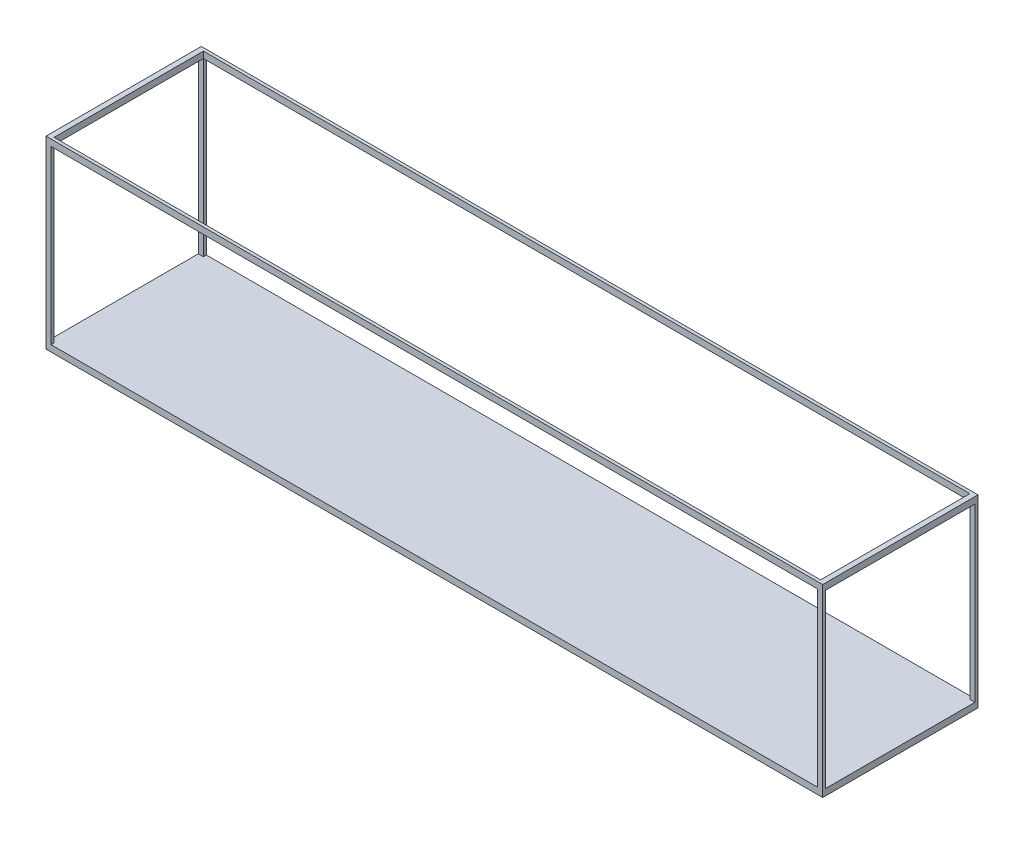
ISO-10303-21;
HEADER;
FILE_DESCRIPTION(('STEP AP214'),'2;1');
FILE_NAME('part.step','',(''),(''),'','','');
FILE_SCHEMA(('AUTOMOTIVE_DESIGN { 1 0 10303 214 1 1 1 1 }'));
ENDSEC;
DATA;
#1=APPLICATION_CONTEXT('core data for automotive mechanical design processes');
#2=APPLICATION_PROTOCOL_DEFINITION('international standard','automotive_design',2000,#1);
#3=PRODUCT_CONTEXT('',#1,'mechanical');
#4=PRODUCT('Part','Part','',(#3));
#5=PRODUCT_RELATED_PRODUCT_CATEGORY('part','',(#4));
#6=PRODUCT_DEFINITION_FORMATION('','',#4);
#7=PRODUCT_DEFINITION_CONTEXT('part definition',#1,'design');
#8=PRODUCT_DEFINITION('design','',#6,#7);
#9=PRODUCT_DEFINITION_SHAPE('','',#8);
#10=(LENGTH_UNIT() NAMED_UNIT(*) SI_UNIT(.MILLI.,.METRE.));
#11=(NAMED_UNIT(*) PLANE_ANGLE_UNIT() SI_UNIT($,.RADIAN.));
#12=(NAMED_UNIT(*) SI_UNIT($,.STERADIAN.) SOLID_ANGLE_UNIT());
#13=UNCERTAINTY_MEASURE_WITH_UNIT(LENGTH_MEASURE(1.E-05),#10,'distance_accuracy_value','');
#14=(GEOMETRIC_REPRESENTATION_CONTEXT(3) GLOBAL_UNCERTAINTY_ASSIGNED_CONTEXT((#13)) GLOBAL_UNIT_ASSIGNED_CONTEXT((#10,
#11,#12)) REPRESENTATION_CONTEXT('',''));
#15=CARTESIAN_POINT('',(0.,0.,0.));
#16=DIRECTION('',(0.,0.,1.));
#17=DIRECTION('',(1.,0.,0.));
#18=AXIS2_PLACEMENT_3D('',#15,#16,#17);
#19=CARTESIAN_POINT('',(-5.31344307270271,2696.81328806584,2438.));
#20=DIRECTION('',(1.,0.,0.));
#21=DIRECTION('',(0.,1.,0.));
#22=AXIS2_PLACEMENT_3D('',#19,#20,#21);
#23=PLANE('',#22);
#24=DIRECTION('',(0.,-1.,0.));
#25=VECTOR('',#24,1.);
#26=CARTESIAN_POINT('',(-5.31344307270271,2696.81328806584,2391.));
#27=LINE('',#26,#25);
#28=CARTESIAN_POINT('',(-5.31344307270309,2696.81328806584,2391.));
#29=VERTEX_POINT('',#28);
#30=CARTESIAN_POINT('',(-5.31344307270238,1.81328806584391,2391.));
#31=VERTEX_POINT('',#30);
#32=EDGE_CURVE('E166',#29,#31,#27,.T.);
#33=ORIENTED_EDGE('',*,*,#32,.F.);
#34=DIRECTION('',(0.,0.,-1.));
#35=VECTOR('',#34,1.);
#36=CARTESIAN_POINT('',(-5.31344307270271,2696.81328806584,2438.));
#37=LINE('',#36,#35);
#38=CARTESIAN_POINT('',(-5.31344307270271,2696.81328806584,2438.));
#39=VERTEX_POINT('',#38);
#40=EDGE_CURVE('E264',#39,#29,#37,.T.);
#41=ORIENTED_EDGE('',*,*,#40,.F.);
#42=DIRECTION('',(0.,-1.,0.));
#43=VECTOR('',#42,1.);
#44=CARTESIAN_POINT('',(-5.31344307270271,2696.81328806584,2438.));
#45=LINE('',#44,#43);
#46=CARTESIAN_POINT('',(-5.31344307270238,1.81328806584391,2438.));
#47=VERTEX_POINT('',#46);
#48=EDGE_CURVE('E243',#39,#47,#45,.T.);
#49=ORIENTED_EDGE('',*,*,#48,.T.);
#50=DIRECTION('',(0.,0.,-1.));
#51=VECTOR('',#50,1.);
#52=CARTESIAN_POINT('',(-5.31344307270238,1.81328806584391,2438.));
#53=LINE('',#52,#51);
#54=EDGE_CURVE('E276',#47,#31,#53,.T.);
#55=ORIENTED_EDGE('',*,*,#54,.T.);
#56=EDGE_LOOP('',(#33,#41,#49,#55));
#57=FACE_BOUND('',#56,.T.);
#58=ADVANCED_FACE('F34',(#57),#23,.T.);
#59=DIRECTION('',(0.,0.,1.));
#60=VECTOR('',#59,1.);
#61=CARTESIAN_POINT('',(-5.31344307270271,2696.81328806584,2438.));
#62=LINE('',#61,#60);
#63=CARTESIAN_POINT('',(-5.31344307270309,2696.81328806584,47.0000000000002));
#64=VERTEX_POINT('',#63);
#65=EDGE_CURVE('E208',#64,#29,#62,.T.);
#66=ORIENTED_EDGE('',*,*,#65,.F.);
#67=DIRECTION('',(0.,1.,0.));
#68=VECTOR('',#67,1.);
#69=CARTESIAN_POINT('',(-5.31344307270349,2696.81328806584,47.));
#70=LINE('',#69,#68);
#71=CARTESIAN_POINT('',(-5.3134430727035,2797.31328806584,47.));
#72=VERTEX_POINT('',#71);
#73=EDGE_CURVE('E239',#64,#72,#70,.T.);
#74=ORIENTED_EDGE('',*,*,#73,.T.);
#75=DIRECTION('',(0.,0.,1.));
#76=VECTOR('',#75,1.);
#77=CARTESIAN_POINT('',(-5.31344307270317,2797.31328806584,2391.));
#78=LINE('',#77,#76);
#79=CARTESIAN_POINT('',(-5.31344307270317,2797.31328806584,2391.));
#80=VERTEX_POINT('',#79);
#81=EDGE_CURVE('E229',#72,#80,#78,.T.);
#82=ORIENTED_EDGE('',*,*,#81,.T.);
#83=DIRECTION('',(0.,1.,0.));
#84=VECTOR('',#83,1.);
#85=CARTESIAN_POINT('',(-5.31344307270316,2696.81328806584,2391.));
#86=LINE('',#85,#84);
#87=EDGE_CURVE('E237',#29,#80,#86,.T.);
#88=ORIENTED_EDGE('',*,*,#87,.F.);
#89=EDGE_LOOP('',(#66,#74,#82,#88));
#90=FACE_BOUND('',#89,.T.);
#91=ADVANCED_FACE('F369',(#90),#23,.T.);
#92=CARTESIAN_POINT('',(12026.6865569273,2696.81328806584,2438.));
#93=DIRECTION('',(-1.,0.,0.));
#94=DIRECTION('',(0.,0.,1.));
#95=AXIS2_PLACEMENT_3D('',#92,#93,#94);
#96=PLANE('',#95);
#97=DIRECTION('',(0.,1.,0.));
#98=VECTOR('',#97,1.);
#99=CARTESIAN_POINT('',(12026.6865569273,2696.81328806584,2391.));
#100=LINE('',#99,#98);
#101=CARTESIAN_POINT('',(12026.6865569273,1.81328806584347,2391.));
#102=VERTEX_POINT('',#101);
#103=CARTESIAN_POINT('',(12026.6865569273,2696.81328806584,2391.));
#104=VERTEX_POINT('',#103);
#105=EDGE_CURVE('E11',#102,#104,#100,.T.);
#106=ORIENTED_EDGE('',*,*,#105,.F.);
#107=DIRECTION('',(0.,0.,-1.));
#108=VECTOR('',#107,1.);
#109=CARTESIAN_POINT('',(12026.6865569273,1.81328806584391,2438.));
#110=LINE('',#109,#108);
#111=CARTESIAN_POINT('',(12026.6865569273,1.81328806584391,2438.));
#112=VERTEX_POINT('',#111);
#113=EDGE_CURVE('E272',#112,#102,#110,.T.);
#114=ORIENTED_EDGE('',*,*,#113,.F.);
#115=DIRECTION('',(0.,1.,0.));
#116=VECTOR('',#115,1.);
#117=CARTESIAN_POINT('',(12026.6865569273,2696.81328806584,2438.));
#118=LINE('',#117,#116);
#119=CARTESIAN_POINT('',(12026.6865569273,2696.81328806584,2438.));
#120=VERTEX_POINT('',#119);
#121=EDGE_CURVE('E248',#112,#120,#118,.T.);
#122=ORIENTED_EDGE('',*,*,#121,.T.);
#123=DIRECTION('',(0.,0.,-1.));
#124=VECTOR('',#123,1.);
#125=CARTESIAN_POINT('',(12026.6865569273,2696.81328806584,2438.));
#126=LINE('',#125,#124);
#127=EDGE_CURVE('E268',#120,#104,#126,.T.);
#128=ORIENTED_EDGE('',*,*,#127,.T.);
#129=EDGE_LOOP('',(#106,#114,#122,#128));
#130=FACE_BOUND('',#129,.T.);
#131=ADVANCED_FACE('F338',(#130),#96,.T.);
#132=DIRECTION('',(0.,0.,-1.));
#133=VECTOR('',#132,1.);
#134=CARTESIAN_POINT('',(12026.6865569273,2696.81328806584,2438.));
#135=LINE('',#134,#133);
#136=CARTESIAN_POINT('',(12026.6865569273,2696.81328806584,47.0000000000002));
#137=VERTEX_POINT('',#136);
#138=EDGE_CURVE('E200',#104,#137,#135,.T.);
#139=ORIENTED_EDGE('',*,*,#138,.F.);
#140=DIRECTION('',(0.,1.,0.));
#141=VECTOR('',#140,1.);
#142=CARTESIAN_POINT('',(12026.6865569273,2696.81328806584,2391.));
#143=LINE('',#142,#141);
#144=CARTESIAN_POINT('',(12026.6865569273,2797.31328806584,2391.));
#145=VERTEX_POINT('',#144);
#146=EDGE_CURVE('E234',#104,#145,#143,.T.);
#147=ORIENTED_EDGE('',*,*,#146,.T.);
#148=DIRECTION('',(0.,0.,-1.));
#149=VECTOR('',#148,1.);
#150=CARTESIAN_POINT('',(12026.6865569273,2797.31328806584,2391.));
#151=LINE('',#150,#149);
#152=CARTESIAN_POINT('',(12026.6865569273,2797.31328806584,46.9999999999984));
#153=VERTEX_POINT('',#152);
#154=EDGE_CURVE('E216',#145,#153,#151,.T.);
#155=ORIENTED_EDGE('',*,*,#154,.T.);
#156=DIRECTION('',(0.,1.,0.));
#157=VECTOR('',#156,1.);
#158=CARTESIAN_POINT('',(12026.6865569273,2696.81328806584,46.9999999999985));
#159=LINE('',#158,#157);
#160=EDGE_CURVE('E224',#137,#153,#159,.T.);
#161=ORIENTED_EDGE('',*,*,#160,.F.);
#162=EDGE_LOOP('',(#139,#147,#155,#161));
#163=FACE_BOUND('',#162,.T.);
#164=ADVANCED_FACE('F349',(#163),#96,.T.);
#165=CARTESIAN_POINT('',(-5.31344307270271,2696.81328806584,2438.));
#166=DIRECTION('',(0.,-1.,0.));
#167=DIRECTION('',(1.,0.,0.));
#168=AXIS2_PLACEMENT_3D('',#165,#166,#167);
#169=PLANE('',#168);
#170=DIRECTION('',(1.,0.,0.));
#171=VECTOR('',#170,1.);
#172=CARTESIAN_POINT('',(12026.6865569273,2696.81328806584,2391.));
#173=LINE('',#172,#171);
#174=EDGE_CURVE('E220',#29,#104,#173,.T.);
#175=ORIENTED_EDGE('',*,*,#174,.T.);
#176=ORIENTED_EDGE('',*,*,#127,.F.);
#177=DIRECTION('',(-1.,0.,0.));
#178=VECTOR('',#177,1.);
#179=CARTESIAN_POINT('',(-5.31344307270271,2696.81328806584,2438.));
#180=LINE('',#179,#178);
#181=EDGE_CURVE('E251',#120,#39,#180,.T.);
#182=ORIENTED_EDGE('',*,*,#181,.T.);
#183=ORIENTED_EDGE('',*,*,#40,.T.);
#184=EDGE_LOOP('',(#175,#176,#182,#183));
#185=FACE_BOUND('',#184,.T.);
#186=ADVANCED_FACE('F327',(#185),#169,.T.);
#187=CARTESIAN_POINT('',(0.,0.,2438.));
#188=DIRECTION('',(0.,0.,-1.));
#189=DIRECTION('',(-1.,0.,0.));
#190=AXIS2_PLACEMENT_3D('',#187,#188,#189);
#191=PLANE('',#190);
#192=DIRECTION('',(0.,1.,0.));
#193=VECTOR('',#192,1.);
#194=CARTESIAN_POINT('',(12106.6865569273,2797.31328806584,2438.));
#195=LINE('',#194,#193);
#196=CARTESIAN_POINT('',(12106.6865569273,-98.6867119341566,2438.));
#197=VERTEX_POINT('',#196);
#198=CARTESIAN_POINT('',(12106.6865569273,2797.31328806584,2438.));
#199=VERTEX_POINT('',#198);
#200=EDGE_CURVE('E279',#197,#199,#195,.T.);
#201=ORIENTED_EDGE('',*,*,#200,.T.);
#202=DIRECTION('',(-1.,0.,0.));
#203=VECTOR('',#202,1.);
#204=CARTESIAN_POINT('',(12106.6865569273,2797.31328806584,2438.));
#205=LINE('',#204,#203);
#206=CARTESIAN_POINT('',(-85.3134430727032,2797.31328806584,2438.));
#207=VERTEX_POINT('',#206);
#208=EDGE_CURVE('E282',#199,#207,#205,.T.);
#209=ORIENTED_EDGE('',*,*,#208,.T.);
#210=DIRECTION('',(0.,-1.,0.));
#211=VECTOR('',#210,1.);
#212=CARTESIAN_POINT('',(-85.3134430727032,2797.31328806584,2438.));
#213=LINE('',#212,#211);
#214=CARTESIAN_POINT('',(-85.3134430727028,-98.6867119341581,2438.));
#215=VERTEX_POINT('',#214);
#216=EDGE_CURVE('E285',#207,#215,#213,.T.);
#217=ORIENTED_EDGE('',*,*,#216,.T.);
#218=DIRECTION('',(1.,0.,0.));
#219=VECTOR('',#218,1.);
#220=CARTESIAN_POINT('',(12106.6865569273,-98.6867119341566,2438.));
#221=LINE('',#220,#219);
#222=EDGE_CURVE('E287',#215,#197,#221,.T.);
#223=ORIENTED_EDGE('',*,*,#222,.T.);
#224=EDGE_LOOP('',(#201,#209,#217,#223));
#225=FACE_BOUND('',#224,.T.);
#226=ORIENTED_EDGE('',*,*,#48,.F.);
#227=ORIENTED_EDGE('',*,*,#181,.F.);
#228=ORIENTED_EDGE('',*,*,#121,.F.);
#229=DIRECTION('',(1.,0.,0.));
#230=VECTOR('',#229,1.);
#231=CARTESIAN_POINT('',(-5.31344307270238,1.81328806584391,2438.));
#232=LINE('',#231,#230);
#233=EDGE_CURVE('E245',#47,#112,#232,.T.);
#234=ORIENTED_EDGE('',*,*,#233,.F.);
#235=EDGE_LOOP('',(#226,#227,#228,#234));
#236=FACE_BOUND('',#235,.T.);
#237=ADVANCED_FACE('F324',(#225,#236),#191,.F.);
#238=CARTESIAN_POINT('',(0.,0.,0.));
#239=DIRECTION('',(0.,0.,-1.));
#240=DIRECTION('',(-1.,0.,0.));
#241=AXIS2_PLACEMENT_3D('',#238,#239,#240);
#242=PLANE('',#241);
#243=DIRECTION('',(0.,1.,0.));
#244=VECTOR('',#243,1.);
#245=CARTESIAN_POINT('',(12106.6865569273,2797.31328806584,0.));
#246=LINE('',#245,#244);
#247=CARTESIAN_POINT('',(12106.6865569273,-98.6867119341566,0.));
#248=VERTEX_POINT('',#247);
#249=CARTESIAN_POINT('',(12106.6865569273,2797.31328806584,0.));
#250=VERTEX_POINT('',#249);
#251=EDGE_CURVE('E278',#248,#250,#246,.T.);
#252=ORIENTED_EDGE('',*,*,#251,.F.);
#253=DIRECTION('',(1.,0.,0.));
#254=VECTOR('',#253,1.);
#255=CARTESIAN_POINT('',(12106.6865569273,-98.6867119341566,0.));
#256=LINE('',#255,#254);
#257=CARTESIAN_POINT('',(-85.3134430727028,-98.6867119341581,0.));
#258=VERTEX_POINT('',#257);
#259=EDGE_CURVE('E283',#258,#248,#256,.T.);
#260=ORIENTED_EDGE('',*,*,#259,.F.);
#261=DIRECTION('',(0.,-1.,0.));
#262=VECTOR('',#261,1.);
#263=CARTESIAN_POINT('',(-85.3134430727032,2797.31328806584,0.));
#264=LINE('',#263,#262);
#265=CARTESIAN_POINT('',(-85.3134430727032,2797.31328806584,0.));
#266=VERTEX_POINT('',#265);
#267=EDGE_CURVE('E294',#266,#258,#264,.T.);
#268=ORIENTED_EDGE('',*,*,#267,.F.);
#269=DIRECTION('',(-1.,0.,0.));
#270=VECTOR('',#269,1.);
#271=CARTESIAN_POINT('',(12106.6865569273,2797.31328806584,0.));
#272=LINE('',#271,#270);
#273=EDGE_CURVE('E292',#250,#266,#272,.T.);
#274=ORIENTED_EDGE('',*,*,#273,.F.);
#275=EDGE_LOOP('',(#252,#260,#268,#274));
#276=FACE_BOUND('',#275,.T.);
#277=DIRECTION('',(-1.,0.,0.));
#278=VECTOR('',#277,1.);
#279=CARTESIAN_POINT('',(-5.31344307270271,2696.81328806584,0.));
#280=LINE('',#279,#278);
#281=CARTESIAN_POINT('',(12026.6865569273,2696.81328806584,0.));
#282=VERTEX_POINT('',#281);
#283=CARTESIAN_POINT('',(-5.31344307270271,2696.81328806584,0.));
#284=VERTEX_POINT('',#283);
#285=EDGE_CURVE('E246',#282,#284,#280,.T.);
#286=ORIENTED_EDGE('',*,*,#285,.T.);
#287=DIRECTION('',(0.,-1.,0.));
#288=VECTOR('',#287,1.);
#289=CARTESIAN_POINT('',(-5.31344307270271,2696.81328806584,0.));
#290=LINE('',#289,#288);
#291=CARTESIAN_POINT('',(-5.31344307270238,1.81328806584391,0.));
#292=VERTEX_POINT('',#291);
#293=EDGE_CURVE('E236',#284,#292,#290,.T.);
#294=ORIENTED_EDGE('',*,*,#293,.T.);
#295=DIRECTION('',(1.,0.,0.));
#296=VECTOR('',#295,1.);
#297=CARTESIAN_POINT('',(-5.31344307270238,1.81328806584391,0.));
#298=LINE('',#297,#296);
#299=CARTESIAN_POINT('',(12026.6865569273,1.81328806584391,0.));
#300=VERTEX_POINT('',#299);
#301=EDGE_CURVE('E256',#292,#300,#298,.T.);
#302=ORIENTED_EDGE('',*,*,#301,.T.);
#303=DIRECTION('',(0.,1.,0.));
#304=VECTOR('',#303,1.);
#305=CARTESIAN_POINT('',(12026.6865569273,2696.81328806584,0.));
#306=LINE('',#305,#304);
#307=EDGE_CURVE('E259',#300,#282,#306,.T.);
#308=ORIENTED_EDGE('',*,*,#307,.T.);
#309=EDGE_LOOP('',(#286,#294,#302,#308));
#310=FACE_BOUND('',#309,.T.);
#311=ADVANCED_FACE('F315',(#276,#310),#242,.T.);
#312=CARTESIAN_POINT('',(12106.6865569273,2797.31328806584,2438.));
#313=DIRECTION('',(-1.,0.,0.));
#314=DIRECTION('',(0.,0.,1.));
#315=AXIS2_PLACEMENT_3D('',#312,#313,#314);
#316=PLANE('',#315);
#317=DIRECTION('',(0.,0.,-1.));
#318=VECTOR('',#317,1.);
#319=CARTESIAN_POINT('',(12106.6865569273,1.81328806584347,2391.));
#320=LINE('',#319,#318);
#321=CARTESIAN_POINT('',(12106.6865569273,1.81328806584347,2391.));
#322=VERTEX_POINT('',#321);
#323=CARTESIAN_POINT('',(12106.6865569273,1.81328806584348,46.9999999999998));
#324=VERTEX_POINT('',#323);
#325=EDGE_CURVE('E193',#322,#324,#320,.T.);
#326=ORIENTED_EDGE('',*,*,#325,.F.);
#327=DIRECTION('',(0.,-1.,0.));
#328=VECTOR('',#327,1.);
#329=CARTESIAN_POINT('',(12106.6865569273,2696.81328806584,2391.));
#330=LINE('',#329,#328);
#331=CARTESIAN_POINT('',(12106.6865569273,2696.81328806584,2391.));
#332=VERTEX_POINT('',#331);
#333=EDGE_CURVE('E49',#332,#322,#330,.T.);
#334=ORIENTED_EDGE('',*,*,#333,.F.);
#335=DIRECTION('',(0.,0.,1.));
#336=VECTOR('',#335,1.);
#337=CARTESIAN_POINT('',(12106.6865569273,2696.81328806584,2391.));
#338=LINE('',#337,#336);
#339=CARTESIAN_POINT('',(12106.6865569273,2696.81328806584,47.0000000000002));
#340=VERTEX_POINT('',#339);
#341=EDGE_CURVE('E184',#340,#332,#338,.T.);
#342=ORIENTED_EDGE('',*,*,#341,.F.);
#343=DIRECTION('',(0.,1.,0.));
#344=VECTOR('',#343,1.);
#345=CARTESIAN_POINT('',(12106.6865569273,2696.81328806584,47.0000000000002));
#346=LINE('',#345,#344);
#347=EDGE_CURVE('E187',#324,#340,#346,.T.);
#348=ORIENTED_EDGE('',*,*,#347,.F.);
#349=EDGE_LOOP('',(#326,#334,#342,#348));
#350=FACE_BOUND('',#349,.T.);
#351=ORIENTED_EDGE('',*,*,#251,.T.);
#352=DIRECTION('',(0.,0.,-1.));
#353=VECTOR('',#352,1.);
#354=CARTESIAN_POINT('',(12106.6865569273,2797.31328806584,2438.));
#355=LINE('',#354,#353);
#356=EDGE_CURVE('E42',#199,#250,#355,.T.);
#357=ORIENTED_EDGE('',*,*,#356,.F.);
#358=ORIENTED_EDGE('',*,*,#200,.F.);
#359=DIRECTION('',(0.,0.,-1.));
#360=VECTOR('',#359,1.);
#361=CARTESIAN_POINT('',(12106.6865569273,-98.6867119341566,2438.));
#362=LINE('',#361,#360);
#363=EDGE_CURVE('E289',#197,#248,#362,.T.);
#364=ORIENTED_EDGE('',*,*,#363,.T.);
#365=EDGE_LOOP('',(#351,#357,#358,#364));
#366=FACE_BOUND('',#365,.T.);
#367=ADVANCED_FACE('F36',(#350,#366),#316,.F.);
#368=CARTESIAN_POINT('',(12106.6865569273,2797.31328806584,2438.));
#369=DIRECTION('',(0.,-1.,0.));
#370=DIRECTION('',(1.,0.,0.));
#371=AXIS2_PLACEMENT_3D('',#368,#369,#370);
#372=PLANE('',#371);
#373=DIRECTION('',(-1.,0.,0.));
#374=VECTOR('',#373,1.);
#375=CARTESIAN_POINT('',(12026.6865569273,2797.31328806584,46.9999999999985));
#376=LINE('',#375,#374);
#377=EDGE_CURVE('E226',#153,#72,#376,.T.);
#378=ORIENTED_EDGE('',*,*,#377,.F.);
#379=ORIENTED_EDGE('',*,*,#154,.F.);
#380=DIRECTION('',(1.,0.,0.));
#381=VECTOR('',#380,1.);
#382=CARTESIAN_POINT('',(12026.6865569273,2797.31328806584,2391.));
#383=LINE('',#382,#381);
#384=EDGE_CURVE('E221',#80,#145,#383,.T.);
#385=ORIENTED_EDGE('',*,*,#384,.F.);
#386=ORIENTED_EDGE('',*,*,#81,.F.);
#387=EDGE_LOOP('',(#378,#379,#385,#386));
#388=FACE_BOUND('',#387,.T.);
#389=ORIENTED_EDGE('',*,*,#273,.T.);
#390=DIRECTION('',(0.,0.,-1.));
#391=VECTOR('',#390,1.);
#392=CARTESIAN_POINT('',(-85.3134430727032,2797.31328806584,2438.));
#393=LINE('',#392,#391);
#394=EDGE_CURVE('E302',#207,#266,#393,.T.);
#395=ORIENTED_EDGE('',*,*,#394,.F.);
#396=ORIENTED_EDGE('',*,*,#208,.F.);
#397=ORIENTED_EDGE('',*,*,#356,.T.);
#398=EDGE_LOOP('',(#389,#395,#396,#397));
#399=FACE_BOUND('',#398,.T.);
#400=ADVANCED_FACE('F307',(#388,#399),#372,.F.);
#401=CARTESIAN_POINT('',(-85.3134430727032,2797.31328806584,2438.));
#402=DIRECTION('',(1.,0.,0.));
#403=DIRECTION('',(0.,1.,0.));
#404=AXIS2_PLACEMENT_3D('',#401,#402,#403);
#405=PLANE('',#404);
#406=DIRECTION('',(0.,0.,1.));
#407=VECTOR('',#406,1.);
#408=CARTESIAN_POINT('',(-85.3134430727032,2696.81328806584,2391.));
#409=LINE('',#408,#407);
#410=CARTESIAN_POINT('',(-85.3134430727032,2696.81328806584,47.0000000000002));
#411=VERTEX_POINT('',#410);
#412=CARTESIAN_POINT('',(-85.3134430727032,2696.81328806584,2391.));
#413=VERTEX_POINT('',#412);
#414=EDGE_CURVE('E183',#411,#413,#409,.T.);
#415=ORIENTED_EDGE('',*,*,#414,.T.);
#416=DIRECTION('',(0.,-1.,0.));
#417=VECTOR('',#416,1.);
#418=CARTESIAN_POINT('',(-85.3134430727032,2696.81328806584,2391.));
#419=LINE('',#418,#417);
#420=CARTESIAN_POINT('',(-85.3134430727032,1.81328806584347,2391.));
#421=VERTEX_POINT('',#420);
#422=EDGE_CURVE('E163',#413,#421,#419,.T.);
#423=ORIENTED_EDGE('',*,*,#422,.T.);
#424=DIRECTION('',(0.,0.,-1.));
#425=VECTOR('',#424,1.);
#426=CARTESIAN_POINT('',(-85.3134430727032,1.81328806584347,2391.));
#427=LINE('',#426,#425);
#428=CARTESIAN_POINT('',(-85.3134430727028,1.81328806584348,47.0000000000002));
#429=VERTEX_POINT('',#428);
#430=EDGE_CURVE('E174',#421,#429,#427,.T.);
#431=ORIENTED_EDGE('',*,*,#430,.T.);
#432=DIRECTION('',(0.,1.,0.));
#433=VECTOR('',#432,1.);
#434=CARTESIAN_POINT('',(-85.3134430727032,2696.81328806584,47.0000000000002));
#435=LINE('',#434,#433);
#436=EDGE_CURVE('E57',#429,#411,#435,.T.);
#437=ORIENTED_EDGE('',*,*,#436,.T.);
#438=EDGE_LOOP('',(#415,#423,#431,#437));
#439=FACE_BOUND('',#438,.T.);
#440=ORIENTED_EDGE('',*,*,#267,.T.);
#441=DIRECTION('',(0.,0.,-1.));
#442=VECTOR('',#441,1.);
#443=CARTESIAN_POINT('',(-85.3134430727028,-98.6867119341581,2438.));
#444=LINE('',#443,#442);
#445=EDGE_CURVE('E299',#215,#258,#444,.T.);
#446=ORIENTED_EDGE('',*,*,#445,.F.);
#447=ORIENTED_EDGE('',*,*,#216,.F.);
#448=ORIENTED_EDGE('',*,*,#394,.T.);
#449=EDGE_LOOP('',(#440,#446,#447,#448));
#450=FACE_BOUND('',#449,.T.);
#451=ADVANCED_FACE('F180',(#439,#450),#405,.F.);
#452=CARTESIAN_POINT('',(12106.6865569273,-98.6867119341566,2438.));
#453=DIRECTION('',(0.,1.,0.));
#454=DIRECTION('',(-1.,0.,0.));
#455=AXIS2_PLACEMENT_3D('',#452,#453,#454);
#456=PLANE('',#455);
#457=ORIENTED_EDGE('',*,*,#259,.T.);
#458=ORIENTED_EDGE('',*,*,#363,.F.);
#459=ORIENTED_EDGE('',*,*,#222,.F.);
#460=ORIENTED_EDGE('',*,*,#445,.T.);
#461=EDGE_LOOP('',(#457,#458,#459,#460));
#462=FACE_BOUND('',#461,.T.);
#463=ADVANCED_FACE('F322',(#462),#456,.F.);
#464=DIRECTION('',(0.,1.,0.));
#465=VECTOR('',#464,1.);
#466=CARTESIAN_POINT('',(-5.31344307270271,2696.81328806584,47.0000000000002));
#467=LINE('',#466,#465);
#468=CARTESIAN_POINT('',(-5.31344307270239,1.81328806584348,46.9999999999998));
#469=VERTEX_POINT('',#468);
#470=EDGE_CURVE('E213',#469,#64,#467,.T.);
#471=ORIENTED_EDGE('',*,*,#470,.F.);
#472=EDGE_CURVE('E275',#469,#292,#53,.T.);
#473=ORIENTED_EDGE('',*,*,#472,.T.);
#474=ORIENTED_EDGE('',*,*,#293,.F.);
#475=EDGE_CURVE('E253',#64,#284,#37,.T.);
#476=ORIENTED_EDGE('',*,*,#475,.F.);
#477=EDGE_LOOP('',(#471,#473,#474,#476));
#478=FACE_BOUND('',#477,.T.);
#479=ADVANCED_FACE('F371',(#478),#23,.T.);
#480=CARTESIAN_POINT('',(-5.31344307270238,1.81328806584391,2438.));
#481=DIRECTION('',(0.,1.,0.));
#482=DIRECTION('',(0.,0.,1.));
#483=AXIS2_PLACEMENT_3D('',#480,#481,#482);
#484=PLANE('',#483);
#485=ORIENTED_EDGE('',*,*,#472,.F.);
#486=DIRECTION('',(1.,0.,0.));
#487=VECTOR('',#486,1.);
#488=CARTESIAN_POINT('',(-85.3134430727032,1.81328806584348,46.9999999999998));
#489=LINE('',#488,#487);
#490=EDGE_CURVE('E177',#429,#469,#489,.T.);
#491=ORIENTED_EDGE('',*,*,#490,.F.);
#492=ORIENTED_EDGE('',*,*,#430,.F.);
#493=DIRECTION('',(1.,0.,0.));
#494=VECTOR('',#493,1.);
#495=CARTESIAN_POINT('',(-85.3134430727032,1.81328806584347,2391.));
#496=LINE('',#495,#494);
#497=EDGE_CURVE('E158',#421,#31,#496,.T.);
#498=ORIENTED_EDGE('',*,*,#497,.T.);
#499=ORIENTED_EDGE('',*,*,#54,.F.);
#500=ORIENTED_EDGE('',*,*,#233,.T.);
#501=ORIENTED_EDGE('',*,*,#113,.T.);
#502=EDGE_CURVE('E171',#102,#322,#496,.T.);
#503=ORIENTED_EDGE('',*,*,#502,.T.);
#504=ORIENTED_EDGE('',*,*,#325,.T.);
#505=CARTESIAN_POINT('',(12026.6865569273,1.81328806584391,47.0000000000002));
#506=VERTEX_POINT('',#505);
#507=EDGE_CURVE('E170',#506,#324,#489,.T.);
#508=ORIENTED_EDGE('',*,*,#507,.F.);
#509=EDGE_CURVE('E271',#506,#300,#110,.T.);
#510=ORIENTED_EDGE('',*,*,#509,.T.);
#511=ORIENTED_EDGE('',*,*,#301,.F.);
#512=EDGE_LOOP('',(#485,#491,#492,#498,#499,#500,#501,#503,#504,#508,#510,#511));
#513=FACE_BOUND('',#512,.T.);
#514=ADVANCED_FACE('F176',(#513),#484,.T.);
#515=DIRECTION('',(0.,-1.,0.));
#516=VECTOR('',#515,1.);
#517=CARTESIAN_POINT('',(12026.6865569273,2696.81328806584,47.0000000000002));
#518=LINE('',#517,#516);
#519=EDGE_CURVE('E210',#137,#506,#518,.T.);
#520=ORIENTED_EDGE('',*,*,#519,.F.);
#521=EDGE_CURVE('E267',#137,#282,#126,.T.);
#522=ORIENTED_EDGE('',*,*,#521,.T.);
#523=ORIENTED_EDGE('',*,*,#307,.F.);
#524=ORIENTED_EDGE('',*,*,#509,.F.);
#525=EDGE_LOOP('',(#520,#522,#523,#524));
#526=FACE_BOUND('',#525,.T.);
#527=ADVANCED_FACE('F364',(#526),#96,.T.);
#528=DIRECTION('',(-1.,0.,0.));
#529=VECTOR('',#528,1.);
#530=CARTESIAN_POINT('',(12026.6865569273,2696.81328806584,46.9999999999985));
#531=LINE('',#530,#529);
#532=EDGE_CURVE('E217',#137,#64,#531,.T.);
#533=ORIENTED_EDGE('',*,*,#532,.T.);
#534=ORIENTED_EDGE('',*,*,#475,.T.);
#535=ORIENTED_EDGE('',*,*,#285,.F.);
#536=ORIENTED_EDGE('',*,*,#521,.F.);
#537=EDGE_LOOP('',(#533,#534,#535,#536));
#538=FACE_BOUND('',#537,.T.);
#539=ADVANCED_FACE('F359',(#538),#169,.T.);
#540=CARTESIAN_POINT('',(12026.6865569273,2696.81328806584,2391.));
#541=DIRECTION('',(0.,0.,1.));
#542=DIRECTION('',(1.,0.,0.));
#543=AXIS2_PLACEMENT_3D('',#540,#541,#542);
#544=PLANE('',#543);
#545=ORIENTED_EDGE('',*,*,#384,.T.);
#546=ORIENTED_EDGE('',*,*,#146,.F.);
#547=ORIENTED_EDGE('',*,*,#174,.F.);
#548=ORIENTED_EDGE('',*,*,#87,.T.);
#549=EDGE_LOOP('',(#545,#546,#547,#548));
#550=FACE_BOUND('',#549,.T.);
#551=ADVANCED_FACE('F353',(#550),#544,.F.);
#552=CARTESIAN_POINT('',(12026.6865569273,2696.81328806584,46.9999999999985));
#553=DIRECTION('',(0.,0.,-1.));
#554=DIRECTION('',(-1.,0.,0.));
#555=AXIS2_PLACEMENT_3D('',#552,#553,#554);
#556=PLANE('',#555);
#557=ORIENTED_EDGE('',*,*,#377,.T.);
#558=ORIENTED_EDGE('',*,*,#73,.F.);
#559=ORIENTED_EDGE('',*,*,#532,.F.);
#560=ORIENTED_EDGE('',*,*,#160,.T.);
#561=EDGE_LOOP('',(#557,#558,#559,#560));
#562=FACE_BOUND('',#561,.T.);
#563=ADVANCED_FACE('F394',(#562),#556,.F.);
#564=CARTESIAN_POINT('',(-85.3134430727032,2696.81328806584,47.0000000000002));
#565=DIRECTION('',(0.,0.,-1.));
#566=DIRECTION('',(0.,1.,0.));
#567=AXIS2_PLACEMENT_3D('',#564,#565,#566);
#568=PLANE('',#567);
#569=ORIENTED_EDGE('',*,*,#519,.T.);
#570=ORIENTED_EDGE('',*,*,#507,.T.);
#571=ORIENTED_EDGE('',*,*,#347,.T.);
#572=DIRECTION('',(1.,0.,0.));
#573=VECTOR('',#572,1.);
#574=CARTESIAN_POINT('',(-85.3134430727032,2696.81328806584,47.0000000000002));
#575=LINE('',#574,#573);
#576=EDGE_CURVE('E205',#137,#340,#575,.T.);
#577=ORIENTED_EDGE('',*,*,#576,.F.);
#578=EDGE_LOOP('',(#569,#570,#571,#577));
#579=FACE_BOUND('',#578,.T.);
#580=ADVANCED_FACE('F404',(#579),#568,.F.);
#581=CARTESIAN_POINT('',(-85.3134430727032,2696.81328806584,2391.));
#582=DIRECTION('',(0.,1.,0.));
#583=DIRECTION('',(0.,0.,1.));
#584=AXIS2_PLACEMENT_3D('',#581,#582,#583);
#585=PLANE('',#584);
#586=ORIENTED_EDGE('',*,*,#138,.T.);
#587=ORIENTED_EDGE('',*,*,#576,.T.);
#588=ORIENTED_EDGE('',*,*,#341,.T.);
#589=DIRECTION('',(1.,0.,0.));
#590=VECTOR('',#589,1.);
#591=CARTESIAN_POINT('',(-85.3134430727032,2696.81328806584,2391.));
#592=LINE('',#591,#590);
#593=EDGE_CURVE('E201',#104,#332,#592,.T.);
#594=ORIENTED_EDGE('',*,*,#593,.F.);
#595=EDGE_LOOP('',(#586,#587,#588,#594));
#596=FACE_BOUND('',#595,.T.);
#597=ADVANCED_FACE('F343',(#596),#585,.F.);
#598=CARTESIAN_POINT('',(-85.3134430727032,2696.81328806584,2391.));
#599=DIRECTION('',(0.,0.,1.));
#600=DIRECTION('',(0.,-1.,0.));
#601=AXIS2_PLACEMENT_3D('',#598,#599,#600);
#602=PLANE('',#601);
#603=ORIENTED_EDGE('',*,*,#105,.T.);
#604=ORIENTED_EDGE('',*,*,#593,.T.);
#605=ORIENTED_EDGE('',*,*,#333,.T.);
#606=ORIENTED_EDGE('',*,*,#502,.F.);
#607=EDGE_LOOP('',(#603,#604,#605,#606));
#608=FACE_BOUND('',#607,.T.);
#609=ADVANCED_FACE('F340',(#608),#602,.F.);
#610=ORIENTED_EDGE('',*,*,#32,.T.);
#611=ORIENTED_EDGE('',*,*,#497,.F.);
#612=ORIENTED_EDGE('',*,*,#422,.F.);
#613=EDGE_CURVE('E198',#413,#29,#592,.T.);
#614=ORIENTED_EDGE('',*,*,#613,.T.);
#615=EDGE_LOOP('',(#610,#611,#612,#614));
#616=FACE_BOUND('',#615,.T.);
#617=ADVANCED_FACE('F160',(#616),#602,.F.);
#618=ORIENTED_EDGE('',*,*,#470,.T.);
#619=EDGE_CURVE('E202',#411,#64,#575,.T.);
#620=ORIENTED_EDGE('',*,*,#619,.F.);
#621=ORIENTED_EDGE('',*,*,#436,.F.);
#622=ORIENTED_EDGE('',*,*,#490,.T.);
#623=EDGE_LOOP('',(#618,#620,#621,#622));
#624=FACE_BOUND('',#623,.T.);
#625=ADVANCED_FACE('F401',(#624),#568,.F.);
#626=ORIENTED_EDGE('',*,*,#65,.T.);
#627=ORIENTED_EDGE('',*,*,#613,.F.);
#628=ORIENTED_EDGE('',*,*,#414,.F.);
#629=ORIENTED_EDGE('',*,*,#619,.T.);
#630=EDGE_LOOP('',(#626,#627,#628,#629));
#631=FACE_BOUND('',#630,.T.);
#632=ADVANCED_FACE('F400',(#631),#585,.F.);
#633=CLOSED_SHELL('',(#58,#91,#131,#164,#186,#237,#311,#367,#400,#451,#463,#479,#514,#527,#539,
#551,#563,#580,#597,#609,#617,#625,#632));
#634=MANIFOLD_SOLID_BREP('B2',#633);
#635=ADVANCED_BREP_SHAPE_REPRESENTATION('',(#18,#634),#14);
#636=SHAPE_DEFINITION_REPRESENTATION(#9,#635);
ENDSEC;
END-ISO-10303-21;
